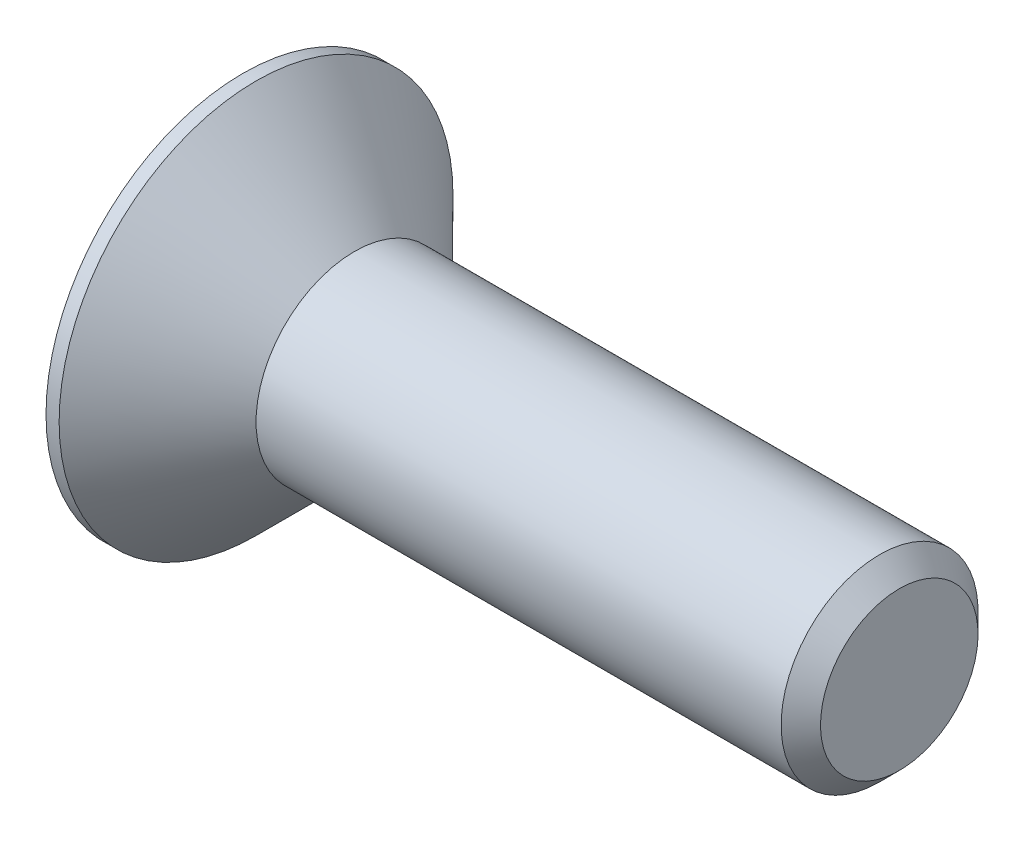
ISO-10303-21;
HEADER;
FILE_DESCRIPTION(('STEP AP214'),'2;1');
FILE_NAME('part.step','',(''),(''),'','','');
FILE_SCHEMA(('AUTOMOTIVE_DESIGN { 1 0 10303 214 1 1 1 1 }'));
ENDSEC;
DATA;
#1=APPLICATION_CONTEXT('core data for automotive mechanical design processes');
#2=APPLICATION_PROTOCOL_DEFINITION('international standard','automotive_design',2000,#1);
#3=PRODUCT_CONTEXT('',#1,'mechanical');
#4=PRODUCT('Part','Part','',(#3));
#5=PRODUCT_RELATED_PRODUCT_CATEGORY('part','',(#4));
#6=PRODUCT_DEFINITION_FORMATION('','',#4);
#7=PRODUCT_DEFINITION_CONTEXT('part definition',#1,'design');
#8=PRODUCT_DEFINITION('design','',#6,#7);
#9=PRODUCT_DEFINITION_SHAPE('','',#8);
#10=(LENGTH_UNIT() NAMED_UNIT(*) SI_UNIT(.MILLI.,.METRE.));
#11=(NAMED_UNIT(*) PLANE_ANGLE_UNIT() SI_UNIT($,.RADIAN.));
#12=(NAMED_UNIT(*) SI_UNIT($,.STERADIAN.) SOLID_ANGLE_UNIT());
#13=UNCERTAINTY_MEASURE_WITH_UNIT(LENGTH_MEASURE(1.E-05),#10,'distance_accuracy_value','');
#14=(GEOMETRIC_REPRESENTATION_CONTEXT(3) GLOBAL_UNCERTAINTY_ASSIGNED_CONTEXT((#13)) GLOBAL_UNIT_ASSIGNED_CONTEXT((#10,
#11,#12)) REPRESENTATION_CONTEXT('',''));
#15=CARTESIAN_POINT('',(0.,0.,0.));
#16=DIRECTION('',(0.,0.,1.));
#17=DIRECTION('',(1.,0.,0.));
#18=AXIS2_PLACEMENT_3D('',#15,#16,#17);
#19=CARTESIAN_POINT('',(0.,-1.,0.5773502691896));
#20=DIRECTION('',(0.,-0.500000000000017,0.866025403784429));
#21=DIRECTION('',(0.,-0.866025403784429,-0.500000000000017));
#22=AXIS2_PLACEMENT_3D('',#19,#20,#21);
#23=PLANE('',#22);
#24=DIRECTION('',(-1.,0.,0.));
#25=VECTOR('',#24,1.);
#26=CARTESIAN_POINT('',(0.7,-1.,0.5773502691896));
#27=LINE('',#26,#25);
#28=CARTESIAN_POINT('',(0.7,-1.,0.5773502691896));
#29=VERTEX_POINT('',#28);
#30=CARTESIAN_POINT('',(0.,-1.,0.5773502691896));
#31=VERTEX_POINT('',#30);
#32=EDGE_CURVE('E11',#29,#31,#27,.T.);
#33=ORIENTED_EDGE('',*,*,#32,.T.);
#34=DIRECTION('',(0.,-0.866025403784429,-0.500000000000017));
#35=VECTOR('',#34,1.);
#36=CARTESIAN_POINT('',(0.,0.,1.154700538379));
#37=LINE('',#36,#35);
#38=CARTESIAN_POINT('',(0.,0.,1.154700538379));
#39=VERTEX_POINT('',#38);
#40=EDGE_CURVE('E36',#39,#31,#37,.T.);
#41=ORIENTED_EDGE('',*,*,#40,.F.);
#42=DIRECTION('',(-1.,0.,0.));
#43=VECTOR('',#42,1.);
#44=CARTESIAN_POINT('',(0.7,0.,1.154700538379));
#45=LINE('',#44,#43);
#46=CARTESIAN_POINT('',(0.7,0.,1.154700538379));
#47=VERTEX_POINT('',#46);
#48=EDGE_CURVE('E82',#47,#39,#45,.T.);
#49=ORIENTED_EDGE('',*,*,#48,.F.);
#50=DIRECTION('',(0.,0.866025403784429,0.500000000000017));
#51=VECTOR('',#50,1.);
#52=CARTESIAN_POINT('',(0.7,-1.,0.5773502691896));
#53=LINE('',#52,#51);
#54=EDGE_CURVE('E263',#29,#47,#53,.T.);
#55=ORIENTED_EDGE('',*,*,#54,.F.);
#56=EDGE_LOOP('',(#33,#41,#49,#55));
#57=FACE_BOUND('',#56,.T.);
#58=ADVANCED_FACE('F17',(#57),#23,.F.);
#59=CARTESIAN_POINT('',(0.7,0.,0.));
#60=DIRECTION('',(-1.,0.,0.));
#61=DIRECTION('',(0.,0.,1.));
#62=AXIS2_PLACEMENT_3D('',#59,#60,#61);
#63=PLANE('',#62);
#64=DIRECTION('',(0.,0.866025403784429,-0.500000000000017));
#65=VECTOR('',#64,1.);
#66=CARTESIAN_POINT('',(0.7,0.,1.154700538379));
#67=LINE('',#66,#65);
#68=CARTESIAN_POINT('',(0.7,1.,0.5773502691896));
#69=VERTEX_POINT('',#68);
#70=EDGE_CURVE('E27',#47,#69,#67,.T.);
#71=ORIENTED_EDGE('',*,*,#70,.T.);
#72=DIRECTION('',(0.,0.,1.));
#73=VECTOR('',#72,1.);
#74=CARTESIAN_POINT('',(0.7,1.,-0.5773502691896));
#75=LINE('',#74,#73);
#76=CARTESIAN_POINT('',(0.7,1.,-0.5773502691896));
#77=VERTEX_POINT('',#76);
#78=EDGE_CURVE('E76',#77,#69,#75,.T.);
#79=ORIENTED_EDGE('',*,*,#78,.F.);
#80=DIRECTION('',(0.,-0.866025403784429,-0.500000000000017));
#81=VECTOR('',#80,1.);
#82=CARTESIAN_POINT('',(0.7,1.,-0.5773502691896));
#83=LINE('',#82,#81);
#84=CARTESIAN_POINT('',(0.7,0.,-1.154700538379));
#85=VERTEX_POINT('',#84);
#86=EDGE_CURVE('E105',#77,#85,#83,.T.);
#87=ORIENTED_EDGE('',*,*,#86,.T.);
#88=DIRECTION('',(0.,-0.866025403784429,0.500000000000017));
#89=VECTOR('',#88,1.);
#90=CARTESIAN_POINT('',(0.7,0.,-1.154700538379));
#91=LINE('',#90,#89);
#92=CARTESIAN_POINT('',(0.7,-1.,-0.5773502691896));
#93=VERTEX_POINT('',#92);
#94=EDGE_CURVE('E102',#85,#93,#91,.T.);
#95=ORIENTED_EDGE('',*,*,#94,.T.);
#96=DIRECTION('',(0.,0.,-1.));
#97=VECTOR('',#96,1.);
#98=CARTESIAN_POINT('',(0.7,-1.,0.5773502691896));
#99=LINE('',#98,#97);
#100=EDGE_CURVE('E113',#29,#93,#99,.T.);
#101=ORIENTED_EDGE('',*,*,#100,.F.);
#102=ORIENTED_EDGE('',*,*,#54,.T.);
#103=EDGE_LOOP('',(#71,#79,#87,#95,#101,#102));
#104=FACE_BOUND('',#103,.T.);
#105=ADVANCED_FACE('F144',(#104),#63,.T.);
#106=CARTESIAN_POINT('',(0.,-1.,-0.5773502691896));
#107=DIRECTION('',(0.,-1.,0.));
#108=DIRECTION('',(0.,0.,-1.));
#109=AXIS2_PLACEMENT_3D('',#106,#107,#108);
#110=PLANE('',#109);
#111=DIRECTION('',(-1.,0.,0.));
#112=VECTOR('',#111,1.);
#113=CARTESIAN_POINT('',(0.7,-1.,-0.5773502691896));
#114=LINE('',#113,#112);
#115=CARTESIAN_POINT('',(0.,-1.,-0.5773502691896));
#116=VERTEX_POINT('',#115);
#117=EDGE_CURVE('E260',#93,#116,#114,.T.);
#118=ORIENTED_EDGE('',*,*,#117,.T.);
#119=DIRECTION('',(0.,0.,1.));
#120=VECTOR('',#119,1.);
#121=CARTESIAN_POINT('',(0.,-1.,-0.5773502691896));
#122=LINE('',#121,#120);
#123=EDGE_CURVE('E108',#116,#31,#122,.T.);
#124=ORIENTED_EDGE('',*,*,#123,.T.);
#125=ORIENTED_EDGE('',*,*,#32,.F.);
#126=ORIENTED_EDGE('',*,*,#100,.T.);
#127=EDGE_LOOP('',(#118,#124,#125,#126));
#128=FACE_BOUND('',#127,.T.);
#129=ADVANCED_FACE('F150',(#128),#110,.F.);
#130=CARTESIAN_POINT('',(0.,1.5,0.));
#131=DIRECTION('',(-1.,0.,0.));
#132=DIRECTION('',(0.,1.,0.));
#133=AXIS2_PLACEMENT_3D('',#130,#131,#132);
#134=PLANE('',#133);
#135=CARTESIAN_POINT('',(0.,0.,0.));
#136=DIRECTION('',(-1.,0.,0.));
#137=DIRECTION('',(0.,-1.,0.));
#138=AXIS2_PLACEMENT_3D('',#135,#136,#137);
#139=CIRCLE('',#138,3.);
#140=CARTESIAN_POINT('',(0.,-3.,0.));
#141=VERTEX_POINT('',#140);
#142=EDGE_CURVE('E110',#141,#141,#139,.T.);
#143=ORIENTED_EDGE('',*,*,#142,.T.);
#144=EDGE_LOOP('',(#143));
#145=FACE_BOUND('',#144,.T.);
#146=ORIENTED_EDGE('',*,*,#123,.F.);
#147=DIRECTION('',(0.,0.866025403784429,-0.500000000000017));
#148=VECTOR('',#147,1.);
#149=CARTESIAN_POINT('',(0.,-1.,-0.5773502691896));
#150=LINE('',#149,#148);
#151=CARTESIAN_POINT('',(0.,0.,-1.154700538379));
#152=VERTEX_POINT('',#151);
#153=EDGE_CURVE('E100',#116,#152,#150,.T.);
#154=ORIENTED_EDGE('',*,*,#153,.T.);
#155=DIRECTION('',(0.,0.866025403784429,0.500000000000017));
#156=VECTOR('',#155,1.);
#157=CARTESIAN_POINT('',(0.,0.,-1.154700538379));
#158=LINE('',#157,#156);
#159=CARTESIAN_POINT('',(0.,1.,-0.5773502691896));
#160=VERTEX_POINT('',#159);
#161=EDGE_CURVE('E73',#152,#160,#158,.T.);
#162=ORIENTED_EDGE('',*,*,#161,.T.);
#163=DIRECTION('',(0.,0.,-1.));
#164=VECTOR('',#163,1.);
#165=CARTESIAN_POINT('',(0.,1.,0.5773502691896));
#166=LINE('',#165,#164);
#167=CARTESIAN_POINT('',(0.,1.,0.5773502691896));
#168=VERTEX_POINT('',#167);
#169=EDGE_CURVE('E67',#168,#160,#166,.T.);
#170=ORIENTED_EDGE('',*,*,#169,.F.);
#171=DIRECTION('',(0.,-0.866025403784429,0.500000000000017));
#172=VECTOR('',#171,1.);
#173=CARTESIAN_POINT('',(0.,1.,0.5773502691896));
#174=LINE('',#173,#172);
#175=EDGE_CURVE('E71',#168,#39,#174,.T.);
#176=ORIENTED_EDGE('',*,*,#175,.T.);
#177=ORIENTED_EDGE('',*,*,#40,.T.);
#178=EDGE_LOOP('',(#146,#154,#162,#170,#176,#177));
#179=FACE_BOUND('',#178,.T.);
#180=ADVANCED_FACE('F70',(#145,#179),#134,.T.);
#181=CARTESIAN_POINT('',(0.1,0.,0.));
#182=DIRECTION('',(1.,0.,0.));
#183=DIRECTION('',(0.,1.,0.));
#184=AXIS2_PLACEMENT_3D('',#181,#182,#183);
#185=CYLINDRICAL_SURFACE('',#184,3.);
#186=CARTESIAN_POINT('',(0.2,0.,0.));
#187=DIRECTION('',(1.,0.,0.));
#188=DIRECTION('',(0.,-1.,0.));
#189=AXIS2_PLACEMENT_3D('',#186,#187,#188);
#190=CIRCLE('',#189,3.);
#191=CARTESIAN_POINT('',(0.2,-3.,0.));
#192=VERTEX_POINT('',#191);
#193=EDGE_CURVE('E117',#192,#192,#190,.T.);
#194=ORIENTED_EDGE('',*,*,#193,.F.);
#195=EDGE_LOOP('',(#194));
#196=FACE_BOUND('',#195,.T.);
#197=ORIENTED_EDGE('',*,*,#142,.F.);
#198=EDGE_LOOP('',(#197));
#199=FACE_BOUND('',#198,.T.);
#200=ADVANCED_FACE('F159',(#196,#199),#185,.T.);
#201=CARTESIAN_POINT('',(0.95,0.,0.));
#202=DIRECTION('',(-1.,0.,0.));
#203=DIRECTION('',(0.,1.,0.));
#204=AXIS2_PLACEMENT_3D('',#201,#202,#203);
#205=CONICAL_SURFACE('',#204,2.25,0.7853981633973);
#206=CARTESIAN_POINT('',(1.7,0.,0.));
#207=DIRECTION('',(-1.,0.,0.));
#208=DIRECTION('',(0.,-1.,0.));
#209=AXIS2_PLACEMENT_3D('',#206,#207,#208);
#210=CIRCLE('',#209,1.5);
#211=CARTESIAN_POINT('',(1.7,-1.5,0.));
#212=VERTEX_POINT('',#211);
#213=EDGE_CURVE('E120',#212,#212,#210,.T.);
#214=ORIENTED_EDGE('',*,*,#213,.T.);
#215=EDGE_LOOP('',(#214));
#216=FACE_BOUND('',#215,.T.);
#217=ORIENTED_EDGE('',*,*,#193,.T.);
#218=EDGE_LOOP('',(#217));
#219=FACE_BOUND('',#218,.T.);
#220=ADVANCED_FACE('F163',(#216,#219),#205,.T.);
#221=CARTESIAN_POINT('',(11.54675,0.,0.));
#222=DIRECTION('',(1.,0.,0.));
#223=DIRECTION('',(0.,1.,0.));
#224=AXIS2_PLACEMENT_3D('',#221,#222,#223);
#225=CYLINDRICAL_SURFACE('',#224,1.5);
#226=CARTESIAN_POINT('',(9.7,0.,0.));
#227=DIRECTION('',(-1.,0.,0.));
#228=DIRECTION('',(0.,1.,0.));
#229=AXIS2_PLACEMENT_3D('',#226,#227,#228);
#230=CIRCLE('',#229,1.5);
#231=CARTESIAN_POINT('',(9.7,1.5,0.));
#232=VERTEX_POINT('',#231);
#233=EDGE_CURVE('E121',#232,#232,#230,.T.);
#234=ORIENTED_EDGE('',*,*,#233,.T.);
#235=EDGE_LOOP('',(#234));
#236=FACE_BOUND('',#235,.T.);
#237=ORIENTED_EDGE('',*,*,#213,.F.);
#238=EDGE_LOOP('',(#237));
#239=FACE_BOUND('',#238,.T.);
#240=ADVANCED_FACE('F141',(#236,#239),#225,.T.);
#241=CARTESIAN_POINT('',(9.850000000045,0.,0.));
#242=DIRECTION('',(-1.,0.,0.));
#243=DIRECTION('',(0.,0.,-1.));
#244=AXIS2_PLACEMENT_3D('',#241,#242,#243);
#245=CONICAL_SURFACE('',#244,1.349999999955,0.7853981633973);
#246=CARTESIAN_POINT('',(10.,0.,0.));
#247=DIRECTION('',(-1.,0.,0.));
#248=DIRECTION('',(0.,1.,0.));
#249=AXIS2_PLACEMENT_3D('',#246,#247,#248);
#250=CIRCLE('',#249,1.2);
#251=CARTESIAN_POINT('',(10.,1.2,0.));
#252=VERTEX_POINT('',#251);
#253=EDGE_CURVE('E87',#252,#252,#250,.T.);
#254=ORIENTED_EDGE('',*,*,#253,.T.);
#255=EDGE_LOOP('',(#254));
#256=FACE_BOUND('',#255,.T.);
#257=ORIENTED_EDGE('',*,*,#233,.F.);
#258=EDGE_LOOP('',(#257));
#259=FACE_BOUND('',#258,.T.);
#260=ADVANCED_FACE('F129',(#256,#259),#245,.T.);
#261=CARTESIAN_POINT('',(10.,0.,0.));
#262=DIRECTION('',(1.,0.,0.));
#263=DIRECTION('',(0.,1.,0.));
#264=AXIS2_PLACEMENT_3D('',#261,#262,#263);
#265=PLANE('',#264);
#266=ORIENTED_EDGE('',*,*,#253,.F.);
#267=EDGE_LOOP('',(#266));
#268=FACE_BOUND('',#267,.T.);
#269=ADVANCED_FACE('F132',(#268),#265,.T.);
#270=CARTESIAN_POINT('',(0.,0.,1.154700538379));
#271=DIRECTION('',(0.,0.500000000000017,0.866025403784429));
#272=DIRECTION('',(0.,-0.866025403784429,0.500000000000017));
#273=AXIS2_PLACEMENT_3D('',#270,#271,#272);
#274=PLANE('',#273);
#275=ORIENTED_EDGE('',*,*,#48,.T.);
#276=ORIENTED_EDGE('',*,*,#175,.F.);
#277=DIRECTION('',(-1.,0.,0.));
#278=VECTOR('',#277,1.);
#279=CARTESIAN_POINT('',(0.7,1.,0.5773502691896));
#280=LINE('',#279,#278);
#281=EDGE_CURVE('E75',#69,#168,#280,.T.);
#282=ORIENTED_EDGE('',*,*,#281,.F.);
#283=ORIENTED_EDGE('',*,*,#70,.F.);
#284=EDGE_LOOP('',(#275,#276,#282,#283));
#285=FACE_BOUND('',#284,.T.);
#286=ADVANCED_FACE('F80',(#285),#274,.F.);
#287=CARTESIAN_POINT('',(0.,1.,0.5773502691896));
#288=DIRECTION('',(0.,1.,0.));
#289=DIRECTION('',(0.,0.,1.));
#290=AXIS2_PLACEMENT_3D('',#287,#288,#289);
#291=PLANE('',#290);
#292=ORIENTED_EDGE('',*,*,#281,.T.);
#293=ORIENTED_EDGE('',*,*,#169,.T.);
#294=DIRECTION('',(-1.,0.,0.));
#295=VECTOR('',#294,1.);
#296=CARTESIAN_POINT('',(0.7,1.,-0.5773502691896));
#297=LINE('',#296,#295);
#298=EDGE_CURVE('E91',#77,#160,#297,.T.);
#299=ORIENTED_EDGE('',*,*,#298,.F.);
#300=ORIENTED_EDGE('',*,*,#78,.T.);
#301=EDGE_LOOP('',(#292,#293,#299,#300));
#302=FACE_BOUND('',#301,.T.);
#303=ADVANCED_FACE('F84',(#302),#291,.F.);
#304=CARTESIAN_POINT('',(0.,1.,-0.5773502691896));
#305=DIRECTION('',(0.,0.500000000000017,-0.866025403784429));
#306=DIRECTION('',(0.,0.866025403784429,0.500000000000017));
#307=AXIS2_PLACEMENT_3D('',#304,#305,#306);
#308=PLANE('',#307);
#309=ORIENTED_EDGE('',*,*,#298,.T.);
#310=ORIENTED_EDGE('',*,*,#161,.F.);
#311=DIRECTION('',(-1.,0.,0.));
#312=VECTOR('',#311,1.);
#313=CARTESIAN_POINT('',(0.7,0.,-1.154700538379));
#314=LINE('',#313,#312);
#315=EDGE_CURVE('E21',#85,#152,#314,.T.);
#316=ORIENTED_EDGE('',*,*,#315,.F.);
#317=ORIENTED_EDGE('',*,*,#86,.F.);
#318=EDGE_LOOP('',(#309,#310,#316,#317));
#319=FACE_BOUND('',#318,.T.);
#320=ADVANCED_FACE('F104',(#319),#308,.F.);
#321=CARTESIAN_POINT('',(0.,0.,-1.154700538379));
#322=DIRECTION('',(0.,-0.500000000000017,-0.866025403784429));
#323=DIRECTION('',(0.,0.866025403784429,-0.500000000000017));
#324=AXIS2_PLACEMENT_3D('',#321,#322,#323);
#325=PLANE('',#324);
#326=ORIENTED_EDGE('',*,*,#315,.T.);
#327=ORIENTED_EDGE('',*,*,#153,.F.);
#328=ORIENTED_EDGE('',*,*,#117,.F.);
#329=ORIENTED_EDGE('',*,*,#94,.F.);
#330=EDGE_LOOP('',(#326,#327,#328,#329));
#331=FACE_BOUND('',#330,.T.);
#332=ADVANCED_FACE('F19',(#331),#325,.F.);
#333=CLOSED_SHELL('',(#58,#105,#129,#180,#200,#220,#240,#260,#269,#286,#303,#320,#332));
#334=MANIFOLD_SOLID_BREP('B1',#333);
#335=ADVANCED_BREP_SHAPE_REPRESENTATION('',(#18,#334),#14);
#336=SHAPE_DEFINITION_REPRESENTATION(#9,#335);
ENDSEC;
END-ISO-10303-21;
